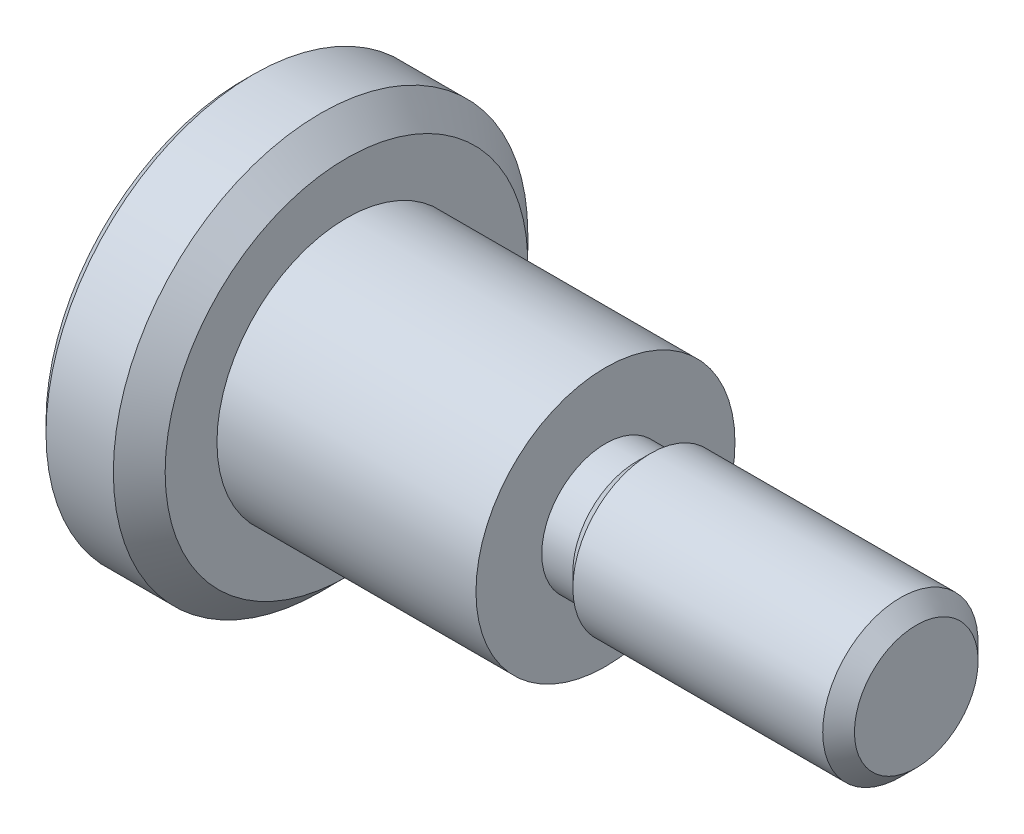
ISO-10303-21;
HEADER;
FILE_DESCRIPTION(('STEP AP214'),'2;1');
FILE_NAME('part.step','',(''),(''),'','','');
FILE_SCHEMA(('AUTOMOTIVE_DESIGN { 1 0 10303 214 1 1 1 1 }'));
ENDSEC;
DATA;
#1=APPLICATION_CONTEXT('core data for automotive mechanical design processes');
#2=APPLICATION_PROTOCOL_DEFINITION('international standard','automotive_design',2000,#1);
#3=PRODUCT_CONTEXT('',#1,'mechanical');
#4=PRODUCT('Part','Part','',(#3));
#5=PRODUCT_RELATED_PRODUCT_CATEGORY('part','',(#4));
#6=PRODUCT_DEFINITION_FORMATION('','',#4);
#7=PRODUCT_DEFINITION_CONTEXT('part definition',#1,'design');
#8=PRODUCT_DEFINITION('design','',#6,#7);
#9=PRODUCT_DEFINITION_SHAPE('','',#8);
#10=(LENGTH_UNIT() NAMED_UNIT(*) SI_UNIT(.MILLI.,.METRE.));
#11=(NAMED_UNIT(*) PLANE_ANGLE_UNIT() SI_UNIT($,.RADIAN.));
#12=(NAMED_UNIT(*) SI_UNIT($,.STERADIAN.) SOLID_ANGLE_UNIT());
#13=UNCERTAINTY_MEASURE_WITH_UNIT(LENGTH_MEASURE(1.E-05),#10,'distance_accuracy_value','');
#14=(GEOMETRIC_REPRESENTATION_CONTEXT(3) GLOBAL_UNCERTAINTY_ASSIGNED_CONTEXT((#13)) GLOBAL_UNIT_ASSIGNED_CONTEXT((#10,
#11,#12)) REPRESENTATION_CONTEXT('',''));
#15=CARTESIAN_POINT('',(0.,0.,0.));
#16=DIRECTION('',(0.,0.,1.));
#17=DIRECTION('',(1.,0.,0.));
#18=AXIS2_PLACEMENT_3D('',#15,#16,#17);
#19=CARTESIAN_POINT('',(-0.5,0.,0.));
#20=DIRECTION('',(-1.,0.,0.));
#21=DIRECTION('',(0.,0.,1.));
#22=AXIS2_PLACEMENT_3D('',#19,#20,#21);
#23=PLANE('',#22);
#24=DIRECTION('',(0.,0.5,0.866025403784439));
#25=VECTOR('',#24,1.);
#26=CARTESIAN_POINT('',(-0.5,1.44337567297406,0.));
#27=LINE('',#26,#25);
#28=CARTESIAN_POINT('',(-0.5,1.44337567297406,0.));
#29=VERTEX_POINT('',#28);
#30=CARTESIAN_POINT('',(-0.5,0.72168783648703,-1.25));
#31=VERTEX_POINT('',#30);
#32=EDGE_CURVE('E90',#29,#31,#27,.F.);
#33=ORIENTED_EDGE('',*,*,#32,.T.);
#34=DIRECTION('',(0.,1.,0.));
#35=VECTOR('',#34,1.);
#36=CARTESIAN_POINT('',(-0.5,0.721687836487032,-1.25));
#37=LINE('',#36,#35);
#38=CARTESIAN_POINT('',(-0.5,-0.721687836487032,-1.25));
#39=VERTEX_POINT('',#38);
#40=EDGE_CURVE('E141',#31,#39,#37,.F.);
#41=ORIENTED_EDGE('',*,*,#40,.T.);
#42=DIRECTION('',(0.,0.5,-0.866025403784439));
#43=VECTOR('',#42,1.);
#44=CARTESIAN_POINT('',(-0.5,-0.721687836487032,-1.25));
#45=LINE('',#44,#43);
#46=CARTESIAN_POINT('',(-0.5,-1.44337567297406,0.));
#47=VERTEX_POINT('',#46);
#48=EDGE_CURVE('E136',#39,#47,#45,.F.);
#49=ORIENTED_EDGE('',*,*,#48,.T.);
#50=DIRECTION('',(0.,-0.5,-0.866025403784439));
#51=VECTOR('',#50,1.);
#52=CARTESIAN_POINT('',(-0.5,-1.44337567297406,0.));
#53=LINE('',#52,#51);
#54=CARTESIAN_POINT('',(-0.5,-0.721687836487031,1.25));
#55=VERTEX_POINT('',#54);
#56=EDGE_CURVE('E73',#47,#55,#53,.F.);
#57=ORIENTED_EDGE('',*,*,#56,.T.);
#58=DIRECTION('',(0.,1.,0.));
#59=VECTOR('',#58,1.);
#60=CARTESIAN_POINT('',(-0.5,-0.721687836487032,1.25));
#61=LINE('',#60,#59);
#62=CARTESIAN_POINT('',(-0.5,0.721687836487032,1.25));
#63=VERTEX_POINT('',#62);
#64=EDGE_CURVE('E70',#55,#63,#61,.T.);
#65=ORIENTED_EDGE('',*,*,#64,.T.);
#66=DIRECTION('',(0.,-0.5,0.866025403784439));
#67=VECTOR('',#66,1.);
#68=CARTESIAN_POINT('',(-0.5,0.721687836487032,1.25));
#69=LINE('',#68,#67);
#70=EDGE_CURVE('E67',#63,#29,#69,.F.);
#71=ORIENTED_EDGE('',*,*,#70,.T.);
#72=EDGE_LOOP('',(#33,#41,#49,#57,#65,#71));
#73=FACE_BOUND('',#72,.T.);
#74=ADVANCED_FACE('F16',(#73),#23,.T.);
#75=CARTESIAN_POINT('',(11.,1.1935,0.));
#76=DIRECTION('',(-1.,0.,0.));
#77=DIRECTION('',(0.,0.,1.));
#78=AXIS2_PLACEMENT_3D('',#75,#76,#77);
#79=PLANE('',#78);
#80=CARTESIAN_POINT('',(11.0000000000241,0.,0.));
#81=DIRECTION('',(-1.,0.,0.));
#82=DIRECTION('',(0.,0.,1.));
#83=AXIS2_PLACEMENT_3D('',#80,#81,#82);
#84=CIRCLE('',#83,1.1934999999994);
#85=CARTESIAN_POINT('',(11.0000000000241,0.,1.1934999999994));
#86=VERTEX_POINT('',#85);
#87=EDGE_CURVE('E19',#86,#86,#84,.T.);
#88=ORIENTED_EDGE('',*,*,#87,.F.);
#89=EDGE_LOOP('',(#88));
#90=FACE_BOUND('',#89,.T.);
#91=ADVANCED_FACE('F369',(#90),#79,.F.);
#92=CARTESIAN_POINT('',(-0.5,-0.721687836487032,1.25));
#93=DIRECTION('',(0.,0.,1.));
#94=DIRECTION('',(1.,0.,0.));
#95=AXIS2_PLACEMENT_3D('',#92,#93,#94);
#96=PLANE('',#95);
#97=DIRECTION('',(1.,0.,0.));
#98=VECTOR('',#97,1.);
#99=CARTESIAN_POINT('',(-0.5,0.721687836487032,1.25));
#100=LINE('',#99,#98);
#101=CARTESIAN_POINT('',(-2.,0.721687836487032,1.25));
#102=VERTEX_POINT('',#101);
#103=EDGE_CURVE('E76',#102,#63,#100,.T.);
#104=ORIENTED_EDGE('',*,*,#103,.T.);
#105=ORIENTED_EDGE('',*,*,#64,.F.);
#106=DIRECTION('',(1.,0.,0.));
#107=VECTOR('',#106,1.);
#108=CARTESIAN_POINT('',(-0.5,-0.721687836487029,1.25));
#109=LINE('',#108,#107);
#110=CARTESIAN_POINT('',(-2.,-0.721687836487031,1.25));
#111=VERTEX_POINT('',#110);
#112=EDGE_CURVE('E131',#55,#111,#109,.F.);
#113=ORIENTED_EDGE('',*,*,#112,.T.);
#114=DIRECTION('',(0.,1.,0.));
#115=VECTOR('',#114,1.);
#116=CARTESIAN_POINT('',(-2.,0.,1.25));
#117=LINE('',#116,#115);
#118=EDGE_CURVE('E81',#111,#102,#117,.T.);
#119=ORIENTED_EDGE('',*,*,#118,.T.);
#120=EDGE_LOOP('',(#104,#105,#113,#119));
#121=FACE_BOUND('',#120,.T.);
#122=ADVANCED_FACE('F79',(#121),#96,.F.);
#123=CARTESIAN_POINT('',(-0.5,0.721687836487032,1.25));
#124=DIRECTION('',(0.,0.866025403784439,0.5));
#125=DIRECTION('',(0.,-0.5,0.866025403784439));
#126=AXIS2_PLACEMENT_3D('',#123,#124,#125);
#127=PLANE('',#126);
#128=DIRECTION('',(1.,0.,0.));
#129=VECTOR('',#128,1.);
#130=CARTESIAN_POINT('',(-0.5,1.44337567297406,0.));
#131=LINE('',#130,#129);
#132=CARTESIAN_POINT('',(-2.,1.44337567297406,0.));
#133=VERTEX_POINT('',#132);
#134=EDGE_CURVE('E87',#133,#29,#131,.T.);
#135=ORIENTED_EDGE('',*,*,#134,.T.);
#136=ORIENTED_EDGE('',*,*,#70,.F.);
#137=ORIENTED_EDGE('',*,*,#103,.F.);
#138=DIRECTION('',(0.,0.499999999999998,-0.86602540378444));
#139=VECTOR('',#138,1.);
#140=CARTESIAN_POINT('',(-2.,0.721687836487032,1.25));
#141=LINE('',#140,#139);
#142=EDGE_CURVE('E128',#102,#133,#141,.T.);
#143=ORIENTED_EDGE('',*,*,#142,.T.);
#144=EDGE_LOOP('',(#135,#136,#137,#143));
#145=FACE_BOUND('',#144,.T.);
#146=ADVANCED_FACE('F85',(#145),#127,.F.);
#147=CARTESIAN_POINT('',(-0.5,1.44337567297406,0.));
#148=DIRECTION('',(0.,0.866025403784439,-0.5));
#149=DIRECTION('',(0.,0.5,0.866025403784439));
#150=AXIS2_PLACEMENT_3D('',#147,#148,#149);
#151=PLANE('',#150);
#152=DIRECTION('',(-1.,0.,0.));
#153=VECTOR('',#152,1.);
#154=CARTESIAN_POINT('',(-0.5,0.721687836487032,-1.25));
#155=LINE('',#154,#153);
#156=CARTESIAN_POINT('',(-2.,0.72168783648703,-1.25));
#157=VERTEX_POINT('',#156);
#158=EDGE_CURVE('E143',#157,#31,#155,.F.);
#159=ORIENTED_EDGE('',*,*,#158,.T.);
#160=ORIENTED_EDGE('',*,*,#32,.F.);
#161=ORIENTED_EDGE('',*,*,#134,.F.);
#162=DIRECTION('',(0.,-0.499999999999998,-0.86602540378444));
#163=VECTOR('',#162,1.);
#164=CARTESIAN_POINT('',(-2.,1.44337567297406,0.));
#165=LINE('',#164,#163);
#166=EDGE_CURVE('E126',#133,#157,#165,.T.);
#167=ORIENTED_EDGE('',*,*,#166,.T.);
#168=EDGE_LOOP('',(#159,#160,#161,#167));
#169=FACE_BOUND('',#168,.T.);
#170=ADVANCED_FACE('F148',(#169),#151,.F.);
#171=CARTESIAN_POINT('',(-0.5,0.721687836487032,-1.25));
#172=DIRECTION('',(0.,0.,-1.));
#173=DIRECTION('',(-1.,0.,0.));
#174=AXIS2_PLACEMENT_3D('',#171,#172,#173);
#175=PLANE('',#174);
#176=DIRECTION('',(1.,0.,0.));
#177=VECTOR('',#176,1.);
#178=CARTESIAN_POINT('',(-0.5,-0.721687836487032,-1.25));
#179=LINE('',#178,#177);
#180=CARTESIAN_POINT('',(-2.,-0.721687836487032,-1.25));
#181=VERTEX_POINT('',#180);
#182=EDGE_CURVE('E138',#181,#39,#179,.T.);
#183=ORIENTED_EDGE('',*,*,#182,.T.);
#184=ORIENTED_EDGE('',*,*,#40,.F.);
#185=ORIENTED_EDGE('',*,*,#158,.F.);
#186=DIRECTION('',(0.,1.,0.));
#187=VECTOR('',#186,1.);
#188=CARTESIAN_POINT('',(-2.,0.,-1.25));
#189=LINE('',#188,#187);
#190=EDGE_CURVE('E124',#157,#181,#189,.F.);
#191=ORIENTED_EDGE('',*,*,#190,.T.);
#192=EDGE_LOOP('',(#183,#184,#185,#191));
#193=FACE_BOUND('',#192,.T.);
#194=ADVANCED_FACE('F152',(#193),#175,.F.);
#195=CARTESIAN_POINT('',(-0.5,-0.721687836487032,-1.25));
#196=DIRECTION('',(0.,-0.866025403784439,-0.5));
#197=DIRECTION('',(0.,0.5,-0.866025403784439));
#198=AXIS2_PLACEMENT_3D('',#195,#196,#197);
#199=PLANE('',#198);
#200=DIRECTION('',(1.,0.,0.));
#201=VECTOR('',#200,1.);
#202=CARTESIAN_POINT('',(-0.5,-1.44337567297406,0.));
#203=LINE('',#202,#201);
#204=CARTESIAN_POINT('',(-2.,-1.44337567297406,0.));
#205=VERTEX_POINT('',#204);
#206=EDGE_CURVE('E134',#205,#47,#203,.T.);
#207=ORIENTED_EDGE('',*,*,#206,.T.);
#208=ORIENTED_EDGE('',*,*,#48,.F.);
#209=ORIENTED_EDGE('',*,*,#182,.F.);
#210=DIRECTION('',(0.,-0.499999999999998,0.86602540378444));
#211=VECTOR('',#210,1.);
#212=CARTESIAN_POINT('',(-2.,-0.721687836487032,-1.25));
#213=LINE('',#212,#211);
#214=EDGE_CURVE('E34',#181,#205,#213,.T.);
#215=ORIENTED_EDGE('',*,*,#214,.T.);
#216=EDGE_LOOP('',(#207,#208,#209,#215));
#217=FACE_BOUND('',#216,.T.);
#218=ADVANCED_FACE('F154',(#217),#199,.F.);
#219=CARTESIAN_POINT('',(-0.5,-1.44337567297406,0.));
#220=DIRECTION('',(0.,-0.866025403784439,0.5));
#221=DIRECTION('',(0.,-0.5,-0.866025403784439));
#222=AXIS2_PLACEMENT_3D('',#219,#220,#221);
#223=PLANE('',#222);
#224=ORIENTED_EDGE('',*,*,#112,.F.);
#225=ORIENTED_EDGE('',*,*,#56,.F.);
#226=ORIENTED_EDGE('',*,*,#206,.F.);
#227=DIRECTION('',(0.,0.499999999999998,0.86602540378444));
#228=VECTOR('',#227,1.);
#229=CARTESIAN_POINT('',(-2.,-1.44337567297406,0.));
#230=LINE('',#229,#228);
#231=EDGE_CURVE('E112',#205,#111,#230,.T.);
#232=ORIENTED_EDGE('',*,*,#231,.T.);
#233=EDGE_LOOP('',(#224,#225,#226,#232));
#234=FACE_BOUND('',#233,.T.);
#235=ADVANCED_FACE('F157',(#234),#223,.F.);
#236=CARTESIAN_POINT('',(10.6934999998884,0.,0.));
#237=DIRECTION('',(-1.,0.,0.));
#238=DIRECTION('',(0.,0.,1.));
#239=AXIS2_PLACEMENT_3D('',#236,#237,#238);
#240=CONICAL_SURFACE('',#239,1.50000000007822,0.785398163304718);
#241=CARTESIAN_POINT('',(10.6935,0.,0.));
#242=DIRECTION('',(-1.,0.,0.));
#243=DIRECTION('',(0.,0.,1.));
#244=AXIS2_PLACEMENT_3D('',#241,#242,#243);
#245=CIRCLE('',#244,1.5);
#246=CARTESIAN_POINT('',(10.6935,0.,1.5));
#247=VERTEX_POINT('',#246);
#248=EDGE_CURVE('E105',#247,#247,#245,.T.);
#249=ORIENTED_EDGE('',*,*,#248,.F.);
#250=EDGE_LOOP('',(#249));
#251=FACE_BOUND('',#250,.T.);
#252=ORIENTED_EDGE('',*,*,#87,.T.);
#253=EDGE_LOOP('',(#252));
#254=FACE_BOUND('',#253,.T.);
#255=ADVANCED_FACE('F163',(#251,#254),#240,.T.);
#256=CARTESIAN_POINT('',(-2.,0.,0.));
#257=DIRECTION('',(1.,0.,0.));
#258=DIRECTION('',(0.,0.,-1.));
#259=AXIS2_PLACEMENT_3D('',#256,#257,#258);
#260=PLANE('',#259);
#261=ORIENTED_EDGE('',*,*,#214,.F.);
#262=ORIENTED_EDGE('',*,*,#190,.F.);
#263=ORIENTED_EDGE('',*,*,#166,.F.);
#264=ORIENTED_EDGE('',*,*,#142,.F.);
#265=ORIENTED_EDGE('',*,*,#118,.F.);
#266=ORIENTED_EDGE('',*,*,#231,.F.);
#267=EDGE_LOOP('',(#261,#262,#263,#264,#265,#266));
#268=FACE_BOUND('',#267,.T.);
#269=CARTESIAN_POINT('',(-1.99999999995271,0.,0.));
#270=DIRECTION('',(1.,0.,0.));
#271=DIRECTION('',(0.,0.,-1.));
#272=AXIS2_PLACEMENT_3D('',#269,#270,#271);
#273=CIRCLE('',#272,3.80000000001246);
#274=CARTESIAN_POINT('',(-1.99999999995271,0.,-3.80000000001246));
#275=VERTEX_POINT('',#274);
#276=EDGE_CURVE('E102',#275,#275,#273,.T.);
#277=ORIENTED_EDGE('',*,*,#276,.F.);
#278=EDGE_LOOP('',(#277));
#279=FACE_BOUND('',#278,.T.);
#280=ADVANCED_FACE('F159',(#268,#279),#260,.F.);
#281=CARTESIAN_POINT('',(11.,0.,0.));
#282=DIRECTION('',(-1.,0.,0.));
#283=DIRECTION('',(0.,0.,1.));
#284=AXIS2_PLACEMENT_3D('',#281,#282,#283);
#285=CYLINDRICAL_SURFACE('',#284,1.5);
#286=CARTESIAN_POINT('',(5.87050000001454,0.,0.));
#287=DIRECTION('',(1.,0.,0.));
#288=DIRECTION('',(0.,0.,-1.));
#289=AXIS2_PLACEMENT_3D('',#286,#287,#288);
#290=CIRCLE('',#289,1.50000000002137);
#291=CARTESIAN_POINT('',(5.87050000001454,0.,-1.50000000002137));
#292=VERTEX_POINT('',#291);
#293=EDGE_CURVE('E104',#292,#292,#290,.F.);
#294=ORIENTED_EDGE('',*,*,#293,.F.);
#295=EDGE_LOOP('',(#294));
#296=FACE_BOUND('',#295,.T.);
#297=ORIENTED_EDGE('',*,*,#248,.T.);
#298=EDGE_LOOP('',(#297));
#299=FACE_BOUND('',#298,.T.);
#300=ADVANCED_FACE('F162',(#296,#299),#285,.T.);
#301=CARTESIAN_POINT('',(-1.80000000005975,0.,0.));
#302=DIRECTION('',(1.,0.,0.));
#303=DIRECTION('',(0.,0.,-1.));
#304=AXIS2_PLACEMENT_3D('',#301,#302,#303);
#305=CONICAL_SURFACE('',#304,3.99999999990541,0.785398163397448);
#306=ORIENTED_EDGE('',*,*,#276,.T.);
#307=EDGE_LOOP('',(#306));
#308=FACE_BOUND('',#307,.T.);
#309=CARTESIAN_POINT('',(-1.8,0.,0.));
#310=DIRECTION('',(-1.,0.,0.));
#311=DIRECTION('',(0.,0.,1.));
#312=AXIS2_PLACEMENT_3D('',#309,#310,#311);
#313=CIRCLE('',#312,4.);
#314=CARTESIAN_POINT('',(-1.8,0.,4.));
#315=VERTEX_POINT('',#314);
#316=EDGE_CURVE('E109',#315,#315,#313,.F.);
#317=ORIENTED_EDGE('',*,*,#316,.F.);
#318=EDGE_LOOP('',(#317));
#319=FACE_BOUND('',#318,.T.);
#320=ADVANCED_FACE('F170',(#308,#319),#305,.T.);
#321=CARTESIAN_POINT('',(5.8704999999577,0.,0.));
#322=DIRECTION('',(1.,0.,0.));
#323=DIRECTION('',(0.,0.,-1.));
#324=AXIS2_PLACEMENT_3D('',#321,#322,#323);
#325=CONICAL_SURFACE('',#324,1.49999999990769,0.785398163397448);
#326=CARTESIAN_POINT('',(5.6,0.,0.));
#327=DIRECTION('',(-1.,0.,0.));
#328=DIRECTION('',(0.,0.,1.));
#329=AXIS2_PLACEMENT_3D('',#326,#327,#328);
#330=CIRCLE('',#329,1.2295);
#331=CARTESIAN_POINT('',(5.6,0.,1.2295));
#332=VERTEX_POINT('',#331);
#333=EDGE_CURVE('E213',#332,#332,#330,.T.);
#334=ORIENTED_EDGE('',*,*,#333,.F.);
#335=EDGE_LOOP('',(#334));
#336=FACE_BOUND('',#335,.T.);
#337=ORIENTED_EDGE('',*,*,#293,.T.);
#338=EDGE_LOOP('',(#337));
#339=FACE_BOUND('',#338,.T.);
#340=ADVANCED_FACE('F202',(#336,#339),#325,.T.);
#341=CARTESIAN_POINT('',(11.,0.,0.));
#342=DIRECTION('',(-1.,0.,0.));
#343=DIRECTION('',(0.,0.,1.));
#344=AXIS2_PLACEMENT_3D('',#341,#342,#343);
#345=CYLINDRICAL_SURFACE('',#344,4.);
#346=ORIENTED_EDGE('',*,*,#316,.T.);
#347=EDGE_LOOP('',(#346));
#348=FACE_BOUND('',#347,.T.);
#349=CARTESIAN_POINT('',(-0.499999999988176,0.,0.));
#350=DIRECTION('',(-1.,0.,0.));
#351=DIRECTION('',(0.,0.,1.));
#352=AXIS2_PLACEMENT_3D('',#349,#350,#351);
#353=CIRCLE('',#352,4.0000000000191);
#354=CARTESIAN_POINT('',(-0.499999999988177,0.,4.0000000000191));
#355=VERTEX_POINT('',#354);
#356=EDGE_CURVE('E101',#355,#355,#353,.F.);
#357=ORIENTED_EDGE('',*,*,#356,.F.);
#358=EDGE_LOOP('',(#357));
#359=FACE_BOUND('',#358,.T.);
#360=ADVANCED_FACE('F198',(#348,#359),#345,.T.);
#361=CARTESIAN_POINT('',(11.,0.,0.));
#362=DIRECTION('',(-1.,0.,0.));
#363=DIRECTION('',(0.,0.,1.));
#364=AXIS2_PLACEMENT_3D('',#361,#362,#363);
#365=CYLINDRICAL_SURFACE('',#364,1.2295);
#366=CARTESIAN_POINT('',(5.,0.,0.));
#367=DIRECTION('',(-1.,0.,0.));
#368=DIRECTION('',(0.,0.,1.));
#369=AXIS2_PLACEMENT_3D('',#366,#367,#368);
#370=CIRCLE('',#369,1.2295);
#371=CARTESIAN_POINT('',(5.,0.,1.2295));
#372=VERTEX_POINT('',#371);
#373=EDGE_CURVE('E99',#372,#372,#370,.F.);
#374=ORIENTED_EDGE('',*,*,#373,.T.);
#375=EDGE_LOOP('',(#374));
#376=FACE_BOUND('',#375,.T.);
#377=ORIENTED_EDGE('',*,*,#333,.T.);
#378=EDGE_LOOP('',(#377));
#379=FACE_BOUND('',#378,.T.);
#380=ADVANCED_FACE('F194',(#376,#379),#365,.T.);
#381=CARTESIAN_POINT('',(-0.499999999988177,0.,0.));
#382=DIRECTION('',(-1.,0.,0.));
#383=DIRECTION('',(0.,0.,1.));
#384=AXIS2_PLACEMENT_3D('',#381,#382,#383);
#385=CONICAL_SURFACE('',#384,4.0000000000191,0.785398163454292);
#386=ORIENTED_EDGE('',*,*,#356,.T.);
#387=EDGE_LOOP('',(#386));
#388=FACE_BOUND('',#387,.T.);
#389=CARTESIAN_POINT('',(0.,0.,0.));
#390=DIRECTION('',(-1.,0.,0.));
#391=DIRECTION('',(0.,0.,1.));
#392=AXIS2_PLACEMENT_3D('',#389,#390,#391);
#393=CIRCLE('',#392,3.49999999997408);
#394=CARTESIAN_POINT('',(0.,0.,3.49999999997408));
#395=VERTEX_POINT('',#394);
#396=EDGE_CURVE('E96',#395,#395,#393,.T.);
#397=ORIENTED_EDGE('',*,*,#396,.T.);
#398=EDGE_LOOP('',(#397));
#399=FACE_BOUND('',#398,.T.);
#400=ADVANCED_FACE('F190',(#388,#399),#385,.T.);
#401=CARTESIAN_POINT('',(5.,2.5,0.));
#402=DIRECTION('',(-1.,0.,0.));
#403=DIRECTION('',(0.,0.,1.));
#404=AXIS2_PLACEMENT_3D('',#401,#402,#403);
#405=PLANE('',#404);
#406=CARTESIAN_POINT('',(5.,0.,0.));
#407=DIRECTION('',(-1.,0.,0.));
#408=DIRECTION('',(0.,0.,1.));
#409=AXIS2_PLACEMENT_3D('',#406,#407,#408);
#410=CIRCLE('',#409,2.5);
#411=CARTESIAN_POINT('',(5.,0.,2.5));
#412=VERTEX_POINT('',#411);
#413=EDGE_CURVE('E25',#412,#412,#410,.T.);
#414=ORIENTED_EDGE('',*,*,#413,.F.);
#415=EDGE_LOOP('',(#414));
#416=FACE_BOUND('',#415,.T.);
#417=ORIENTED_EDGE('',*,*,#373,.F.);
#418=EDGE_LOOP('',(#417));
#419=FACE_BOUND('',#418,.T.);
#420=ADVANCED_FACE('F183',(#416,#419),#405,.F.);
#421=CARTESIAN_POINT('',(0.,3.5,0.));
#422=DIRECTION('',(-1.,0.,0.));
#423=DIRECTION('',(0.,0.,1.));
#424=AXIS2_PLACEMENT_3D('',#421,#422,#423);
#425=PLANE('',#424);
#426=ORIENTED_EDGE('',*,*,#396,.F.);
#427=EDGE_LOOP('',(#426));
#428=FACE_BOUND('',#427,.T.);
#429=CARTESIAN_POINT('',(0.,0.,0.));
#430=DIRECTION('',(-1.,0.,0.));
#431=DIRECTION('',(0.,0.,1.));
#432=AXIS2_PLACEMENT_3D('',#429,#430,#431);
#433=CIRCLE('',#432,2.5);
#434=CARTESIAN_POINT('',(0.,0.,2.5));
#435=VERTEX_POINT('',#434);
#436=EDGE_CURVE('E10',#435,#435,#433,.F.);
#437=ORIENTED_EDGE('',*,*,#436,.F.);
#438=EDGE_LOOP('',(#437));
#439=FACE_BOUND('',#438,.T.);
#440=ADVANCED_FACE('F177',(#428,#439),#425,.F.);
#441=CARTESIAN_POINT('',(11.,0.,0.));
#442=DIRECTION('',(-1.,0.,0.));
#443=DIRECTION('',(0.,0.,1.));
#444=AXIS2_PLACEMENT_3D('',#441,#442,#443);
#445=CYLINDRICAL_SURFACE('',#444,2.5);
#446=ORIENTED_EDGE('',*,*,#436,.T.);
#447=EDGE_LOOP('',(#446));
#448=FACE_BOUND('',#447,.T.);
#449=ORIENTED_EDGE('',*,*,#413,.T.);
#450=EDGE_LOOP('',(#449));
#451=FACE_BOUND('',#450,.T.);
#452=ADVANCED_FACE('F175',(#448,#451),#445,.T.);
#453=CLOSED_SHELL('',(#74,#91,#122,#146,#170,#194,#218,#235,#255,#280,#300,#320,#340,#360,#380,
#400,#420,#440,#452));
#454=MANIFOLD_SOLID_BREP('B1',#453);
#455=ADVANCED_BREP_SHAPE_REPRESENTATION('',(#18,#454),#14);
#456=SHAPE_DEFINITION_REPRESENTATION(#9,#455);
ENDSEC;
END-ISO-10303-21;
